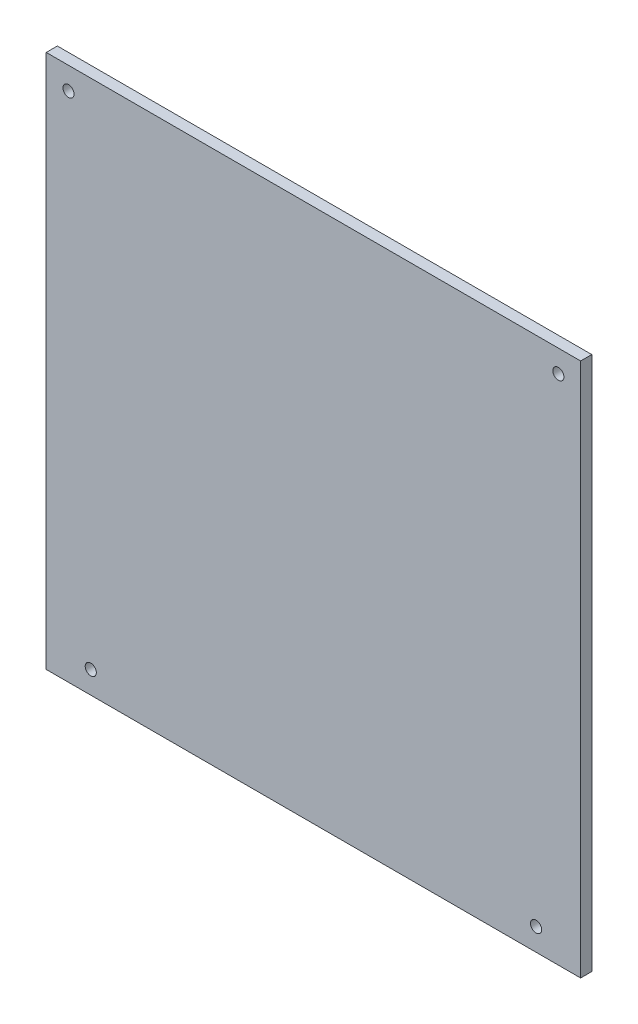
ISO-10303-21;
HEADER;
FILE_DESCRIPTION(('STEP AP214'),'2;1');
FILE_NAME('part.step','',(''),(''),'','','');
FILE_SCHEMA(('AUTOMOTIVE_DESIGN { 1 0 10303 214 1 1 1 1 }'));
ENDSEC;
DATA;
#1=APPLICATION_CONTEXT('core data for automotive mechanical design processes');
#2=APPLICATION_PROTOCOL_DEFINITION('international standard','automotive_design',2000,#1);
#3=PRODUCT_CONTEXT('',#1,'mechanical');
#4=PRODUCT('Part','Part','',(#3));
#5=PRODUCT_RELATED_PRODUCT_CATEGORY('part','',(#4));
#6=PRODUCT_DEFINITION_FORMATION('','',#4);
#7=PRODUCT_DEFINITION_CONTEXT('part definition',#1,'design');
#8=PRODUCT_DEFINITION('design','',#6,#7);
#9=PRODUCT_DEFINITION_SHAPE('','',#8);
#10=(LENGTH_UNIT() NAMED_UNIT(*) SI_UNIT(.MILLI.,.METRE.));
#11=(NAMED_UNIT(*) PLANE_ANGLE_UNIT() SI_UNIT($,.RADIAN.));
#12=(NAMED_UNIT(*) SI_UNIT($,.STERADIAN.) SOLID_ANGLE_UNIT());
#13=UNCERTAINTY_MEASURE_WITH_UNIT(LENGTH_MEASURE(1.E-05),#10,'distance_accuracy_value','');
#14=(GEOMETRIC_REPRESENTATION_CONTEXT(3) GLOBAL_UNCERTAINTY_ASSIGNED_CONTEXT((#13)) GLOBAL_UNIT_ASSIGNED_CONTEXT((#10,
#11,#12)) REPRESENTATION_CONTEXT('',''));
#15=CARTESIAN_POINT('',(0.,0.,0.));
#16=DIRECTION('',(0.,0.,1.));
#17=DIRECTION('',(1.,0.,0.));
#18=AXIS2_PLACEMENT_3D('',#15,#16,#17);
#19=CARTESIAN_POINT('',(0.,0.,6.35));
#20=DIRECTION('',(0.,0.,-1.));
#21=DIRECTION('',(-1.,0.,0.));
#22=AXIS2_PLACEMENT_3D('',#19,#20,#21);
#23=PLANE('',#22);
#24=DIRECTION('',(0.,1.,0.));
#25=VECTOR('',#24,1.);
#26=CARTESIAN_POINT('',(152.4,-152.4,6.35));
#27=LINE('',#26,#25);
#28=CARTESIAN_POINT('',(152.4,-152.4,6.35));
#29=VERTEX_POINT('',#28);
#30=CARTESIAN_POINT('',(152.4,152.4,6.35));
#31=VERTEX_POINT('',#30);
#32=EDGE_CURVE('E87',#29,#31,#27,.T.);
#33=ORIENTED_EDGE('',*,*,#32,.T.);
#34=DIRECTION('',(-1.,0.,0.));
#35=VECTOR('',#34,1.);
#36=CARTESIAN_POINT('',(-152.4,152.4,6.35));
#37=LINE('',#36,#35);
#38=CARTESIAN_POINT('',(-152.4,152.4,6.35));
#39=VERTEX_POINT('',#38);
#40=EDGE_CURVE('E82',#31,#39,#37,.T.);
#41=ORIENTED_EDGE('',*,*,#40,.T.);
#42=DIRECTION('',(0.,-1.,0.));
#43=VECTOR('',#42,1.);
#44=CARTESIAN_POINT('',(-152.4,-152.4,6.35));
#45=LINE('',#44,#43);
#46=CARTESIAN_POINT('',(-152.4,-152.4,6.35));
#47=VERTEX_POINT('',#46);
#48=EDGE_CURVE('E85',#39,#47,#45,.T.);
#49=ORIENTED_EDGE('',*,*,#48,.T.);
#50=DIRECTION('',(1.,0.,0.));
#51=VECTOR('',#50,1.);
#52=CARTESIAN_POINT('',(-152.4,-152.4,6.35));
#53=LINE('',#52,#51);
#54=EDGE_CURVE('E52',#47,#29,#53,.T.);
#55=ORIENTED_EDGE('',*,*,#54,.T.);
#56=EDGE_LOOP('',(#33,#41,#49,#55));
#57=FACE_BOUND('',#56,.T.);
#58=CARTESIAN_POINT('',(139.7,139.7,6.35));
#59=DIRECTION('',(0.,0.,1.));
#60=DIRECTION('',(1.,0.,0.));
#61=AXIS2_PLACEMENT_3D('',#58,#59,#60);
#62=CIRCLE('',#61,3.17499999999997);
#63=CARTESIAN_POINT('',(142.875,139.7,6.35));
#64=VERTEX_POINT('',#63);
#65=EDGE_CURVE('E102',#64,#64,#62,.T.);
#66=ORIENTED_EDGE('',*,*,#65,.F.);
#67=EDGE_LOOP('',(#66));
#68=FACE_BOUND('',#67,.T.);
#69=CARTESIAN_POINT('',(-139.7,139.7,6.35));
#70=DIRECTION('',(0.,0.,1.));
#71=DIRECTION('',(1.,0.,0.));
#72=AXIS2_PLACEMENT_3D('',#69,#70,#71);
#73=CIRCLE('',#72,3.175);
#74=CARTESIAN_POINT('',(-136.525,139.7,6.35));
#75=VERTEX_POINT('',#74);
#76=EDGE_CURVE('E117',#75,#75,#73,.T.);
#77=ORIENTED_EDGE('',*,*,#76,.F.);
#78=EDGE_LOOP('',(#77));
#79=FACE_BOUND('',#78,.T.);
#80=CARTESIAN_POINT('',(127.,-139.7,6.35));
#81=DIRECTION('',(0.,0.,1.));
#82=DIRECTION('',(1.,0.,0.));
#83=AXIS2_PLACEMENT_3D('',#80,#81,#82);
#84=CIRCLE('',#83,3.17499999999997);
#85=CARTESIAN_POINT('',(130.175,-139.7,6.35));
#86=VERTEX_POINT('',#85);
#87=EDGE_CURVE('E123',#86,#86,#84,.T.);
#88=ORIENTED_EDGE('',*,*,#87,.F.);
#89=EDGE_LOOP('',(#88));
#90=FACE_BOUND('',#89,.T.);
#91=CARTESIAN_POINT('',(-127.,-139.7,6.35));
#92=DIRECTION('',(0.,0.,1.));
#93=DIRECTION('',(1.,0.,0.));
#94=AXIS2_PLACEMENT_3D('',#91,#92,#93);
#95=CIRCLE('',#94,3.17499999999997);
#96=CARTESIAN_POINT('',(-123.825,-139.7,6.35));
#97=VERTEX_POINT('',#96);
#98=EDGE_CURVE('E129',#97,#97,#95,.T.);
#99=ORIENTED_EDGE('',*,*,#98,.F.);
#100=EDGE_LOOP('',(#99));
#101=FACE_BOUND('',#100,.T.);
#102=ADVANCED_FACE('F35',(#57,#68,#79,#90,#101),#23,.F.);
#103=CARTESIAN_POINT('',(0.,0.,0.));
#104=DIRECTION('',(0.,0.,-1.));
#105=DIRECTION('',(-1.,0.,0.));
#106=AXIS2_PLACEMENT_3D('',#103,#104,#105);
#107=PLANE('',#106);
#108=CARTESIAN_POINT('',(127.,-139.7,0.));
#109=DIRECTION('',(0.,0.,1.));
#110=DIRECTION('',(1.,0.,0.));
#111=AXIS2_PLACEMENT_3D('',#108,#109,#110);
#112=CIRCLE('',#111,3.17499999999997);
#113=CARTESIAN_POINT('',(130.175,-139.7,0.));
#114=VERTEX_POINT('',#113);
#115=EDGE_CURVE('E126',#114,#114,#112,.T.);
#116=ORIENTED_EDGE('',*,*,#115,.T.);
#117=EDGE_LOOP('',(#116));
#118=FACE_BOUND('',#117,.T.);
#119=CARTESIAN_POINT('',(139.7,139.7,0.));
#120=DIRECTION('',(0.,0.,1.));
#121=DIRECTION('',(1.,0.,0.));
#122=AXIS2_PLACEMENT_3D('',#119,#120,#121);
#123=CIRCLE('',#122,3.17499999999997);
#124=CARTESIAN_POINT('',(142.875,139.7,0.));
#125=VERTEX_POINT('',#124);
#126=EDGE_CURVE('E114',#125,#125,#123,.T.);
#127=ORIENTED_EDGE('',*,*,#126,.T.);
#128=EDGE_LOOP('',(#127));
#129=FACE_BOUND('',#128,.T.);
#130=DIRECTION('',(0.,1.,0.));
#131=VECTOR('',#130,1.);
#132=CARTESIAN_POINT('',(152.4,-152.4,0.));
#133=LINE('',#132,#131);
#134=CARTESIAN_POINT('',(152.4,-152.4,0.));
#135=VERTEX_POINT('',#134);
#136=CARTESIAN_POINT('',(152.4,152.4,0.));
#137=VERTEX_POINT('',#136);
#138=EDGE_CURVE('E99',#135,#137,#133,.T.);
#139=ORIENTED_EDGE('',*,*,#138,.F.);
#140=DIRECTION('',(1.,0.,0.));
#141=VECTOR('',#140,1.);
#142=CARTESIAN_POINT('',(-152.4,-152.4,0.));
#143=LINE('',#142,#141);
#144=CARTESIAN_POINT('',(-152.4,-152.4,0.));
#145=VERTEX_POINT('',#144);
#146=EDGE_CURVE('E75',#145,#135,#143,.T.);
#147=ORIENTED_EDGE('',*,*,#146,.F.);
#148=DIRECTION('',(0.,-1.,0.));
#149=VECTOR('',#148,1.);
#150=CARTESIAN_POINT('',(-152.4,-152.4,0.));
#151=LINE('',#150,#149);
#152=CARTESIAN_POINT('',(-152.4,152.4,0.));
#153=VERTEX_POINT('',#152);
#154=EDGE_CURVE('E69',#153,#145,#151,.T.);
#155=ORIENTED_EDGE('',*,*,#154,.F.);
#156=DIRECTION('',(-1.,0.,0.));
#157=VECTOR('',#156,1.);
#158=CARTESIAN_POINT('',(-152.4,152.4,0.));
#159=LINE('',#158,#157);
#160=EDGE_CURVE('E91',#137,#153,#159,.T.);
#161=ORIENTED_EDGE('',*,*,#160,.F.);
#162=EDGE_LOOP('',(#139,#147,#155,#161));
#163=FACE_BOUND('',#162,.T.);
#164=CARTESIAN_POINT('',(-139.7,139.7,0.));
#165=DIRECTION('',(0.,0.,1.));
#166=DIRECTION('',(1.,0.,0.));
#167=AXIS2_PLACEMENT_3D('',#164,#165,#166);
#168=CIRCLE('',#167,3.175);
#169=CARTESIAN_POINT('',(-136.525,139.7,0.));
#170=VERTEX_POINT('',#169);
#171=EDGE_CURVE('E120',#170,#170,#168,.T.);
#172=ORIENTED_EDGE('',*,*,#171,.T.);
#173=EDGE_LOOP('',(#172));
#174=FACE_BOUND('',#173,.T.);
#175=CARTESIAN_POINT('',(-127.,-139.7,0.));
#176=DIRECTION('',(0.,0.,1.));
#177=DIRECTION('',(1.,0.,0.));
#178=AXIS2_PLACEMENT_3D('',#175,#176,#177);
#179=CIRCLE('',#178,3.17499999999997);
#180=CARTESIAN_POINT('',(-123.825,-139.7,0.));
#181=VERTEX_POINT('',#180);
#182=EDGE_CURVE('E132',#181,#181,#179,.T.);
#183=ORIENTED_EDGE('',*,*,#182,.T.);
#184=EDGE_LOOP('',(#183));
#185=FACE_BOUND('',#184,.T.);
#186=ADVANCED_FACE('F110',(#118,#129,#163,#174,#185),#107,.T.);
#187=CARTESIAN_POINT('',(152.4,-152.4,6.35));
#188=DIRECTION('',(-1.,0.,0.));
#189=DIRECTION('',(0.,0.,1.));
#190=AXIS2_PLACEMENT_3D('',#187,#188,#189);
#191=PLANE('',#190);
#192=ORIENTED_EDGE('',*,*,#138,.T.);
#193=DIRECTION('',(0.,0.,-1.));
#194=VECTOR('',#193,1.);
#195=CARTESIAN_POINT('',(152.4,152.4,6.35));
#196=LINE('',#195,#194);
#197=EDGE_CURVE('E11',#31,#137,#196,.T.);
#198=ORIENTED_EDGE('',*,*,#197,.F.);
#199=ORIENTED_EDGE('',*,*,#32,.F.);
#200=DIRECTION('',(0.,0.,-1.));
#201=VECTOR('',#200,1.);
#202=CARTESIAN_POINT('',(152.4,-152.4,6.35));
#203=LINE('',#202,#201);
#204=EDGE_CURVE('E95',#29,#135,#203,.T.);
#205=ORIENTED_EDGE('',*,*,#204,.T.);
#206=EDGE_LOOP('',(#192,#198,#199,#205));
#207=FACE_BOUND('',#206,.T.);
#208=ADVANCED_FACE('F37',(#207),#191,.F.);
#209=CARTESIAN_POINT('',(-152.4,152.4,6.35));
#210=DIRECTION('',(0.,-1.,0.));
#211=DIRECTION('',(0.,0.,-1.));
#212=AXIS2_PLACEMENT_3D('',#209,#210,#211);
#213=PLANE('',#212);
#214=ORIENTED_EDGE('',*,*,#160,.T.);
#215=DIRECTION('',(0.,0.,-1.));
#216=VECTOR('',#215,1.);
#217=CARTESIAN_POINT('',(-152.4,152.4,6.35));
#218=LINE('',#217,#216);
#219=EDGE_CURVE('E44',#39,#153,#218,.T.);
#220=ORIENTED_EDGE('',*,*,#219,.F.);
#221=ORIENTED_EDGE('',*,*,#40,.F.);
#222=ORIENTED_EDGE('',*,*,#197,.T.);
#223=EDGE_LOOP('',(#214,#220,#221,#222));
#224=FACE_BOUND('',#223,.T.);
#225=ADVANCED_FACE('F90',(#224),#213,.F.);
#226=CARTESIAN_POINT('',(-152.4,-152.4,6.35));
#227=DIRECTION('',(1.,0.,0.));
#228=DIRECTION('',(0.,0.,-1.));
#229=AXIS2_PLACEMENT_3D('',#226,#227,#228);
#230=PLANE('',#229);
#231=ORIENTED_EDGE('',*,*,#154,.T.);
#232=DIRECTION('',(0.,0.,-1.));
#233=VECTOR('',#232,1.);
#234=CARTESIAN_POINT('',(-152.4,-152.4,6.35));
#235=LINE('',#234,#233);
#236=EDGE_CURVE('E92',#47,#145,#235,.T.);
#237=ORIENTED_EDGE('',*,*,#236,.F.);
#238=ORIENTED_EDGE('',*,*,#48,.F.);
#239=ORIENTED_EDGE('',*,*,#219,.T.);
#240=EDGE_LOOP('',(#231,#237,#238,#239));
#241=FACE_BOUND('',#240,.T.);
#242=ADVANCED_FACE('F93',(#241),#230,.F.);
#243=CARTESIAN_POINT('',(-152.4,-152.4,6.35));
#244=DIRECTION('',(0.,1.,0.));
#245=DIRECTION('',(0.,0.,1.));
#246=AXIS2_PLACEMENT_3D('',#243,#244,#245);
#247=PLANE('',#246);
#248=ORIENTED_EDGE('',*,*,#146,.T.);
#249=ORIENTED_EDGE('',*,*,#204,.F.);
#250=ORIENTED_EDGE('',*,*,#54,.F.);
#251=ORIENTED_EDGE('',*,*,#236,.T.);
#252=EDGE_LOOP('',(#248,#249,#250,#251));
#253=FACE_BOUND('',#252,.T.);
#254=ADVANCED_FACE('F107',(#253),#247,.F.);
#255=CARTESIAN_POINT('',(139.7,139.7,6.35));
#256=DIRECTION('',(0.,0.,-1.));
#257=DIRECTION('',(-1.,0.,0.));
#258=AXIS2_PLACEMENT_3D('',#255,#256,#257);
#259=CYLINDRICAL_SURFACE('',#258,3.17499999999997);
#260=ORIENTED_EDGE('',*,*,#65,.T.);
#261=EDGE_LOOP('',(#260));
#262=FACE_BOUND('',#261,.T.);
#263=ORIENTED_EDGE('',*,*,#126,.F.);
#264=EDGE_LOOP('',(#263));
#265=FACE_BOUND('',#264,.T.);
#266=ADVANCED_FACE('F149',(#262,#265),#259,.F.);
#267=CARTESIAN_POINT('',(-139.7,139.7,6.35));
#268=DIRECTION('',(0.,0.,-1.));
#269=DIRECTION('',(-1.,0.,0.));
#270=AXIS2_PLACEMENT_3D('',#267,#268,#269);
#271=CYLINDRICAL_SURFACE('',#270,3.175);
#272=ORIENTED_EDGE('',*,*,#76,.T.);
#273=EDGE_LOOP('',(#272));
#274=FACE_BOUND('',#273,.T.);
#275=ORIENTED_EDGE('',*,*,#171,.F.);
#276=EDGE_LOOP('',(#275));
#277=FACE_BOUND('',#276,.T.);
#278=ADVANCED_FACE('F195',(#274,#277),#271,.F.);
#279=CARTESIAN_POINT('',(127.,-139.7,6.35));
#280=DIRECTION('',(0.,0.,-1.));
#281=DIRECTION('',(-1.,0.,0.));
#282=AXIS2_PLACEMENT_3D('',#279,#280,#281);
#283=CYLINDRICAL_SURFACE('',#282,3.17499999999997);
#284=ORIENTED_EDGE('',*,*,#87,.T.);
#285=EDGE_LOOP('',(#284));
#286=FACE_BOUND('',#285,.T.);
#287=ORIENTED_EDGE('',*,*,#115,.F.);
#288=EDGE_LOOP('',(#287));
#289=FACE_BOUND('',#288,.T.);
#290=ADVANCED_FACE('F203',(#286,#289),#283,.F.);
#291=CARTESIAN_POINT('',(-127.,-139.7,6.35));
#292=DIRECTION('',(0.,0.,-1.));
#293=DIRECTION('',(-1.,0.,0.));
#294=AXIS2_PLACEMENT_3D('',#291,#292,#293);
#295=CYLINDRICAL_SURFACE('',#294,3.17499999999997);
#296=ORIENTED_EDGE('',*,*,#98,.T.);
#297=EDGE_LOOP('',(#296));
#298=FACE_BOUND('',#297,.T.);
#299=ORIENTED_EDGE('',*,*,#182,.F.);
#300=EDGE_LOOP('',(#299));
#301=FACE_BOUND('',#300,.T.);
#302=ADVANCED_FACE('F138',(#298,#301),#295,.F.);
#303=CLOSED_SHELL('',(#102,#186,#208,#225,#242,#254,#266,#278,#290,#302));
#304=MANIFOLD_SOLID_BREP('B2',#303);
#305=ADVANCED_BREP_SHAPE_REPRESENTATION('',(#18,#304),#14);
#306=SHAPE_DEFINITION_REPRESENTATION(#9,#305);
ENDSEC;
END-ISO-10303-21;
